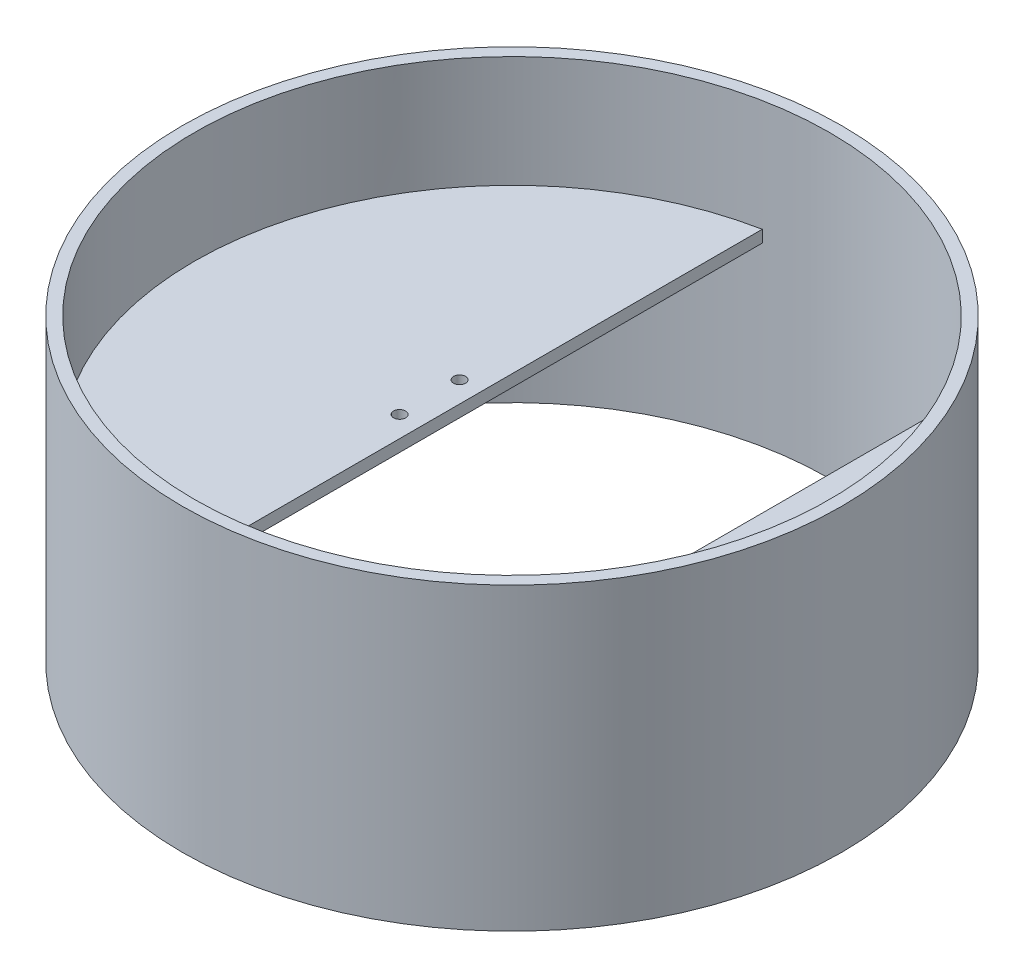
ISO-10303-21;
HEADER;
FILE_DESCRIPTION(('STEP AP214'),'2;1');
FILE_NAME('part.step','',(''),(''),'','','');
FILE_SCHEMA(('AUTOMOTIVE_DESIGN { 1 0 10303 214 1 1 1 1 }'));
ENDSEC;
DATA;
#1=APPLICATION_CONTEXT('core data for automotive mechanical design processes');
#2=APPLICATION_PROTOCOL_DEFINITION('international standard','automotive_design',2000,#1);
#3=PRODUCT_CONTEXT('',#1,'mechanical');
#4=PRODUCT('Part','Part','',(#3));
#5=PRODUCT_RELATED_PRODUCT_CATEGORY('part','',(#4));
#6=PRODUCT_DEFINITION_FORMATION('','',#4);
#7=PRODUCT_DEFINITION_CONTEXT('part definition',#1,'design');
#8=PRODUCT_DEFINITION('design','',#6,#7);
#9=PRODUCT_DEFINITION_SHAPE('','',#8);
#10=(LENGTH_UNIT() NAMED_UNIT(*) SI_UNIT(.MILLI.,.METRE.));
#11=(NAMED_UNIT(*) PLANE_ANGLE_UNIT() SI_UNIT($,.RADIAN.));
#12=(NAMED_UNIT(*) SI_UNIT($,.STERADIAN.) SOLID_ANGLE_UNIT());
#13=UNCERTAINTY_MEASURE_WITH_UNIT(LENGTH_MEASURE(1.E-05),#10,'distance_accuracy_value','');
#14=(GEOMETRIC_REPRESENTATION_CONTEXT(3) GLOBAL_UNCERTAINTY_ASSIGNED_CONTEXT((#13)) GLOBAL_UNIT_ASSIGNED_CONTEXT((#10,
#11,#12)) REPRESENTATION_CONTEXT('',''));
#15=CARTESIAN_POINT('',(0.,0.,0.));
#16=DIRECTION('',(0.,0.,1.));
#17=DIRECTION('',(1.,0.,0.));
#18=AXIS2_PLACEMENT_3D('',#15,#16,#17);
#19=CARTESIAN_POINT('',(0.,50.,0.));
#20=DIRECTION('',(0.,1.,0.));
#21=DIRECTION('',(0.,0.,1.));
#22=AXIS2_PLACEMENT_3D('',#19,#20,#21);
#23=PLANE('',#22);
#24=CARTESIAN_POINT('',(0.,50.,0.));
#25=DIRECTION('',(0.,1.,0.));
#26=DIRECTION('',(0.,0.,1.));
#27=AXIS2_PLACEMENT_3D('',#24,#25,#26);
#28=CIRCLE('',#27,55.);
#29=CARTESIAN_POINT('',(0.,50.,55.));
#30=VERTEX_POINT('',#29);
#31=EDGE_CURVE('E196',#30,#30,#28,.T.);
#32=ORIENTED_EDGE('',*,*,#31,.T.);
#33=EDGE_LOOP('',(#32));
#34=FACE_BOUND('',#33,.T.);
#35=CARTESIAN_POINT('',(0.,50.,0.));
#36=DIRECTION('',(0.,1.,0.));
#37=DIRECTION('',(0.,0.,1.));
#38=AXIS2_PLACEMENT_3D('',#35,#36,#37);
#39=CIRCLE('',#38,53.);
#40=CARTESIAN_POINT('',(0.,50.,53.));
#41=VERTEX_POINT('',#40);
#42=EDGE_CURVE('E195',#41,#41,#39,.T.);
#43=ORIENTED_EDGE('',*,*,#42,.F.);
#44=EDGE_LOOP('',(#43));
#45=FACE_BOUND('',#44,.T.);
#46=ADVANCED_FACE('F43',(#34,#45),#23,.T.);
#47=CARTESIAN_POINT('',(0.,0.,0.));
#48=DIRECTION('',(0.,1.,0.));
#49=DIRECTION('',(0.,0.,1.));
#50=AXIS2_PLACEMENT_3D('',#47,#48,#49);
#51=PLANE('',#50);
#52=CARTESIAN_POINT('',(0.,0.,0.));
#53=DIRECTION('',(0.,1.,0.));
#54=DIRECTION('',(0.,0.,1.));
#55=AXIS2_PLACEMENT_3D('',#52,#53,#54);
#56=CIRCLE('',#55,55.);
#57=CARTESIAN_POINT('',(0.,0.,55.));
#58=VERTEX_POINT('',#57);
#59=EDGE_CURVE('E194',#58,#58,#56,.T.);
#60=ORIENTED_EDGE('',*,*,#59,.F.);
#61=EDGE_LOOP('',(#60));
#62=FACE_BOUND('',#61,.T.);
#63=CARTESIAN_POINT('',(0.,0.,0.));
#64=DIRECTION('',(0.,1.,0.));
#65=DIRECTION('',(0.,0.,1.));
#66=AXIS2_PLACEMENT_3D('',#63,#64,#65);
#67=CIRCLE('',#66,53.);
#68=CARTESIAN_POINT('',(0.,0.,53.));
#69=VERTEX_POINT('',#68);
#70=EDGE_CURVE('E187',#69,#69,#67,.T.);
#71=ORIENTED_EDGE('',*,*,#70,.T.);
#72=EDGE_LOOP('',(#71));
#73=FACE_BOUND('',#72,.T.);
#74=ADVANCED_FACE('F131',(#62,#73),#51,.F.);
#75=CARTESIAN_POINT('',(0.,50.,0.));
#76=DIRECTION('',(0.,-1.,0.));
#77=DIRECTION('',(0.,0.,-1.));
#78=AXIS2_PLACEMENT_3D('',#75,#76,#77);
#79=CYLINDRICAL_SURFACE('',#78,55.);
#80=ORIENTED_EDGE('',*,*,#31,.F.);
#81=EDGE_LOOP('',(#80));
#82=FACE_BOUND('',#81,.T.);
#83=ORIENTED_EDGE('',*,*,#59,.T.);
#84=EDGE_LOOP('',(#83));
#85=FACE_BOUND('',#84,.T.);
#86=ADVANCED_FACE('F44',(#82,#85),#79,.T.);
#87=CARTESIAN_POINT('',(0.,50.,0.));
#88=DIRECTION('',(0.,-1.,0.));
#89=DIRECTION('',(0.,0.,-1.));
#90=AXIS2_PLACEMENT_3D('',#87,#88,#89);
#91=CYLINDRICAL_SURFACE('',#90,53.);
#92=CARTESIAN_POINT('',(0.,31.4,0.));
#93=DIRECTION('',(0.,1.,0.));
#94=DIRECTION('',(0.,0.,1.));
#95=AXIS2_PLACEMENT_3D('',#92,#93,#94);
#96=CIRCLE('',#95,53.);
#97=CARTESIAN_POINT('',(-10.25,31.4,-51.9993990349888));
#98=VERTEX_POINT('',#97);
#99=CARTESIAN_POINT('',(-10.25,31.4,51.9993990349888));
#100=VERTEX_POINT('',#99);
#101=EDGE_CURVE('E11',#98,#100,#96,.T.);
#102=ORIENTED_EDGE('',*,*,#101,.F.);
#103=DIRECTION('',(0.,-1.,0.));
#104=VECTOR('',#103,1.);
#105=CARTESIAN_POINT('',(-10.25,50.,-51.9993990349888));
#106=LINE('',#105,#104);
#107=CARTESIAN_POINT('',(-10.25,29.4,-51.9993990349888));
#108=VERTEX_POINT('',#107);
#109=EDGE_CURVE('E55',#108,#98,#106,.F.);
#110=ORIENTED_EDGE('',*,*,#109,.F.);
#111=CARTESIAN_POINT('',(0.,29.4,0.));
#112=DIRECTION('',(0.,1.,0.));
#113=DIRECTION('',(0.,0.,1.));
#114=AXIS2_PLACEMENT_3D('',#111,#112,#113);
#115=CIRCLE('',#114,53.);
#116=CARTESIAN_POINT('',(-10.25,29.4,51.9993990349888));
#117=VERTEX_POINT('',#116);
#118=EDGE_CURVE('E82',#108,#117,#115,.T.);
#119=ORIENTED_EDGE('',*,*,#118,.T.);
#120=DIRECTION('',(0.,-1.,0.));
#121=VECTOR('',#120,1.);
#122=CARTESIAN_POINT('',(-10.25,50.,51.9993990349888));
#123=LINE('',#122,#121);
#124=EDGE_CURVE('E86',#100,#117,#123,.T.);
#125=ORIENTED_EDGE('',*,*,#124,.F.);
#126=EDGE_LOOP('',(#102,#110,#119,#125));
#127=FACE_BOUND('',#126,.T.);
#128=CARTESIAN_POINT('',(0.,31.4,0.));
#129=DIRECTION('',(0.,1.,0.));
#130=DIRECTION('',(0.,0.,1.));
#131=AXIS2_PLACEMENT_3D('',#128,#129,#130);
#132=CIRCLE('',#131,53.);
#133=CARTESIAN_POINT('',(30.75,31.4,43.1675514709834));
#134=VERTEX_POINT('',#133);
#135=CARTESIAN_POINT('',(30.75,31.4,-43.1675514709834));
#136=VERTEX_POINT('',#135);
#137=EDGE_CURVE('E90',#134,#136,#132,.T.);
#138=ORIENTED_EDGE('',*,*,#137,.F.);
#139=DIRECTION('',(0.,-1.,0.));
#140=VECTOR('',#139,1.);
#141=CARTESIAN_POINT('',(30.75,50.,43.1675514709834));
#142=LINE('',#141,#140);
#143=CARTESIAN_POINT('',(30.75,29.4,43.1675514709834));
#144=VERTEX_POINT('',#143);
#145=EDGE_CURVE('E202',#144,#134,#142,.F.);
#146=ORIENTED_EDGE('',*,*,#145,.F.);
#147=CARTESIAN_POINT('',(0.,29.4,0.));
#148=DIRECTION('',(0.,1.,0.));
#149=DIRECTION('',(0.,0.,1.));
#150=AXIS2_PLACEMENT_3D('',#147,#148,#149);
#151=CIRCLE('',#150,53.);
#152=CARTESIAN_POINT('',(30.75,29.4,-43.1675514709834));
#153=VERTEX_POINT('',#152);
#154=EDGE_CURVE('E199',#144,#153,#151,.T.);
#155=ORIENTED_EDGE('',*,*,#154,.T.);
#156=DIRECTION('',(0.,-1.,0.));
#157=VECTOR('',#156,1.);
#158=CARTESIAN_POINT('',(30.75,50.,-43.1675514709834));
#159=LINE('',#158,#157);
#160=EDGE_CURVE('E210',#136,#153,#159,.T.);
#161=ORIENTED_EDGE('',*,*,#160,.F.);
#162=EDGE_LOOP('',(#138,#146,#155,#161));
#163=FACE_BOUND('',#162,.T.);
#164=ORIENTED_EDGE('',*,*,#42,.T.);
#165=EDGE_LOOP('',(#164));
#166=FACE_BOUND('',#165,.T.);
#167=ORIENTED_EDGE('',*,*,#70,.F.);
#168=EDGE_LOOP('',(#167));
#169=FACE_BOUND('',#168,.T.);
#170=ADVANCED_FACE('F98',(#127,#163,#166,#169),#91,.F.);
#171=CARTESIAN_POINT('',(30.75,31.4,-43.1675514709834));
#172=DIRECTION('',(-1.,0.,0.));
#173=DIRECTION('',(0.,0.,1.));
#174=AXIS2_PLACEMENT_3D('',#171,#172,#173);
#175=PLANE('',#174);
#176=DIRECTION('',(0.,0.,1.));
#177=VECTOR('',#176,1.);
#178=CARTESIAN_POINT('',(30.75,31.4,-43.1675514709834));
#179=LINE('',#178,#177);
#180=EDGE_CURVE('E186',#136,#134,#179,.T.);
#181=ORIENTED_EDGE('',*,*,#180,.F.);
#182=ORIENTED_EDGE('',*,*,#160,.T.);
#183=DIRECTION('',(0.,0.,1.));
#184=VECTOR('',#183,1.);
#185=CARTESIAN_POINT('',(30.75,29.4,0.));
#186=LINE('',#185,#184);
#187=EDGE_CURVE('E66',#153,#144,#186,.T.);
#188=ORIENTED_EDGE('',*,*,#187,.T.);
#189=ORIENTED_EDGE('',*,*,#145,.T.);
#190=EDGE_LOOP('',(#181,#182,#188,#189));
#191=FACE_BOUND('',#190,.T.);
#192=ADVANCED_FACE('F145',(#191),#175,.T.);
#193=CARTESIAN_POINT('',(0.,31.4,0.));
#194=DIRECTION('',(0.,1.,0.));
#195=DIRECTION('',(0.,0.,1.));
#196=AXIS2_PLACEMENT_3D('',#193,#194,#195);
#197=PLANE('',#196);
#198=CARTESIAN_POINT('',(34.25,31.4,-4.99999999999999));
#199=DIRECTION('',(0.,1.,0.));
#200=DIRECTION('',(0.,0.,-1.));
#201=AXIS2_PLACEMENT_3D('',#198,#199,#200);
#202=CIRCLE('',#201,0.999999999999998);
#203=CARTESIAN_POINT('',(34.25,31.4,-5.99999999999999));
#204=VERTEX_POINT('',#203);
#205=EDGE_CURVE('E177',#204,#204,#202,.T.);
#206=ORIENTED_EDGE('',*,*,#205,.F.);
#207=EDGE_LOOP('',(#206));
#208=FACE_BOUND('',#207,.T.);
#209=CARTESIAN_POINT('',(34.25,31.4,4.99999999999999));
#210=DIRECTION('',(0.,1.,0.));
#211=DIRECTION('',(0.,0.,1.));
#212=AXIS2_PLACEMENT_3D('',#209,#210,#211);
#213=CIRCLE('',#212,0.999999999999998);
#214=CARTESIAN_POINT('',(34.25,31.4,5.99999999999999));
#215=VERTEX_POINT('',#214);
#216=EDGE_CURVE('E179',#215,#215,#213,.T.);
#217=ORIENTED_EDGE('',*,*,#216,.F.);
#218=EDGE_LOOP('',(#217));
#219=FACE_BOUND('',#218,.T.);
#220=ORIENTED_EDGE('',*,*,#180,.T.);
#221=ORIENTED_EDGE('',*,*,#137,.T.);
#222=EDGE_LOOP('',(#220,#221));
#223=FACE_BOUND('',#222,.T.);
#224=ADVANCED_FACE('F150',(#208,#219,#223),#197,.T.);
#225=CARTESIAN_POINT('',(0.,29.4,0.));
#226=DIRECTION('',(0.,1.,0.));
#227=DIRECTION('',(0.,0.,1.));
#228=AXIS2_PLACEMENT_3D('',#225,#226,#227);
#229=PLANE('',#228);
#230=CARTESIAN_POINT('',(34.25,29.4,-4.99999999999999));
#231=DIRECTION('',(0.,1.,0.));
#232=DIRECTION('',(0.,0.,1.));
#233=AXIS2_PLACEMENT_3D('',#230,#231,#232);
#234=CIRCLE('',#233,0.999999999999998);
#235=CARTESIAN_POINT('',(34.25,29.4,-4.));
#236=VERTEX_POINT('',#235);
#237=EDGE_CURVE('E50',#236,#236,#234,.T.);
#238=ORIENTED_EDGE('',*,*,#237,.T.);
#239=EDGE_LOOP('',(#238));
#240=FACE_BOUND('',#239,.T.);
#241=CARTESIAN_POINT('',(34.25,29.4,4.99999999999999));
#242=DIRECTION('',(0.,1.,0.));
#243=DIRECTION('',(0.,0.,1.));
#244=AXIS2_PLACEMENT_3D('',#241,#242,#243);
#245=CIRCLE('',#244,0.999999999999998);
#246=CARTESIAN_POINT('',(34.25,29.4,5.99999999999999));
#247=VERTEX_POINT('',#246);
#248=EDGE_CURVE('E108',#247,#247,#245,.T.);
#249=ORIENTED_EDGE('',*,*,#248,.T.);
#250=EDGE_LOOP('',(#249));
#251=FACE_BOUND('',#250,.T.);
#252=ORIENTED_EDGE('',*,*,#154,.F.);
#253=ORIENTED_EDGE('',*,*,#187,.F.);
#254=EDGE_LOOP('',(#252,#253));
#255=FACE_BOUND('',#254,.T.);
#256=ADVANCED_FACE('F119',(#240,#251,#255),#229,.F.);
#257=CARTESIAN_POINT('',(-10.25,31.4,-51.9993990349888));
#258=DIRECTION('',(-1.,0.,0.));
#259=DIRECTION('',(0.,0.,1.));
#260=AXIS2_PLACEMENT_3D('',#257,#258,#259);
#261=PLANE('',#260);
#262=DIRECTION('',(0.,0.,1.));
#263=VECTOR('',#262,1.);
#264=CARTESIAN_POINT('',(-10.25,29.4,0.));
#265=LINE('',#264,#263);
#266=EDGE_CURVE('E56',#108,#117,#265,.T.);
#267=ORIENTED_EDGE('',*,*,#266,.F.);
#268=ORIENTED_EDGE('',*,*,#109,.T.);
#269=DIRECTION('',(0.,0.,1.));
#270=VECTOR('',#269,1.);
#271=CARTESIAN_POINT('',(-10.25,31.4,-51.9993990349888));
#272=LINE('',#271,#270);
#273=EDGE_CURVE('E92',#98,#100,#272,.T.);
#274=ORIENTED_EDGE('',*,*,#273,.T.);
#275=ORIENTED_EDGE('',*,*,#124,.T.);
#276=EDGE_LOOP('',(#267,#268,#274,#275));
#277=FACE_BOUND('',#276,.T.);
#278=ADVANCED_FACE('F95',(#277),#261,.F.);
#279=CARTESIAN_POINT('',(0.,31.4,0.));
#280=DIRECTION('',(0.,1.,0.));
#281=DIRECTION('',(0.,0.,1.));
#282=AXIS2_PLACEMENT_3D('',#279,#280,#281);
#283=PLANE('',#282);
#284=CARTESIAN_POINT('',(-13.75,31.4,-5.));
#285=DIRECTION('',(0.,1.,0.));
#286=DIRECTION('',(0.,0.,-1.));
#287=AXIS2_PLACEMENT_3D('',#284,#285,#286);
#288=CIRCLE('',#287,1.);
#289=CARTESIAN_POINT('',(-13.75,31.4,-6.));
#290=VERTEX_POINT('',#289);
#291=EDGE_CURVE('E175',#290,#290,#288,.T.);
#292=ORIENTED_EDGE('',*,*,#291,.F.);
#293=EDGE_LOOP('',(#292));
#294=FACE_BOUND('',#293,.T.);
#295=CARTESIAN_POINT('',(-13.75,31.4,5.));
#296=DIRECTION('',(0.,1.,0.));
#297=DIRECTION('',(0.,0.,1.));
#298=AXIS2_PLACEMENT_3D('',#295,#296,#297);
#299=CIRCLE('',#298,1.);
#300=CARTESIAN_POINT('',(-13.75,31.4,6.));
#301=VERTEX_POINT('',#300);
#302=EDGE_CURVE('E110',#301,#301,#299,.T.);
#303=ORIENTED_EDGE('',*,*,#302,.F.);
#304=EDGE_LOOP('',(#303));
#305=FACE_BOUND('',#304,.T.);
#306=ORIENTED_EDGE('',*,*,#273,.F.);
#307=ORIENTED_EDGE('',*,*,#101,.T.);
#308=EDGE_LOOP('',(#306,#307));
#309=FACE_BOUND('',#308,.T.);
#310=ADVANCED_FACE('F156',(#294,#305,#309),#283,.T.);
#311=CARTESIAN_POINT('',(0.,29.4,0.));
#312=DIRECTION('',(0.,1.,0.));
#313=DIRECTION('',(0.,0.,1.));
#314=AXIS2_PLACEMENT_3D('',#311,#312,#313);
#315=PLANE('',#314);
#316=CARTESIAN_POINT('',(-13.75,29.4,-5.));
#317=DIRECTION('',(0.,1.,0.));
#318=DIRECTION('',(0.,0.,1.));
#319=AXIS2_PLACEMENT_3D('',#316,#317,#318);
#320=CIRCLE('',#319,1.);
#321=CARTESIAN_POINT('',(-13.75,29.4,-4.));
#322=VERTEX_POINT('',#321);
#323=EDGE_CURVE('E106',#322,#322,#320,.T.);
#324=ORIENTED_EDGE('',*,*,#323,.T.);
#325=EDGE_LOOP('',(#324));
#326=FACE_BOUND('',#325,.T.);
#327=CARTESIAN_POINT('',(-13.75,29.4,5.));
#328=DIRECTION('',(0.,1.,0.));
#329=DIRECTION('',(0.,0.,1.));
#330=AXIS2_PLACEMENT_3D('',#327,#328,#329);
#331=CIRCLE('',#330,1.);
#332=CARTESIAN_POINT('',(-13.75,29.4,6.));
#333=VERTEX_POINT('',#332);
#334=EDGE_CURVE('E103',#333,#333,#331,.T.);
#335=ORIENTED_EDGE('',*,*,#334,.T.);
#336=EDGE_LOOP('',(#335));
#337=FACE_BOUND('',#336,.T.);
#338=ORIENTED_EDGE('',*,*,#118,.F.);
#339=ORIENTED_EDGE('',*,*,#266,.T.);
#340=EDGE_LOOP('',(#338,#339));
#341=FACE_BOUND('',#340,.T.);
#342=ADVANCED_FACE('F83',(#326,#337,#341),#315,.F.);
#343=CARTESIAN_POINT('',(-13.75,0.,5.));
#344=DIRECTION('',(0.,1.,0.));
#345=DIRECTION('',(0.,0.,1.));
#346=AXIS2_PLACEMENT_3D('',#343,#344,#345);
#347=CYLINDRICAL_SURFACE('',#346,1.);
#348=ORIENTED_EDGE('',*,*,#302,.T.);
#349=EDGE_LOOP('',(#348));
#350=FACE_BOUND('',#349,.T.);
#351=ORIENTED_EDGE('',*,*,#334,.F.);
#352=EDGE_LOOP('',(#351));
#353=FACE_BOUND('',#352,.T.);
#354=ADVANCED_FACE('F157',(#350,#353),#347,.F.);
#355=CARTESIAN_POINT('',(-13.75,0.,-5.));
#356=DIRECTION('',(0.,1.,0.));
#357=DIRECTION('',(0.,0.,1.));
#358=AXIS2_PLACEMENT_3D('',#355,#356,#357);
#359=CYLINDRICAL_SURFACE('',#358,1.);
#360=ORIENTED_EDGE('',*,*,#291,.T.);
#361=EDGE_LOOP('',(#360));
#362=FACE_BOUND('',#361,.T.);
#363=ORIENTED_EDGE('',*,*,#323,.F.);
#364=EDGE_LOOP('',(#363));
#365=FACE_BOUND('',#364,.T.);
#366=ADVANCED_FACE('F127',(#362,#365),#359,.F.);
#367=CARTESIAN_POINT('',(34.25,0.,4.99999999999999));
#368=DIRECTION('',(0.,1.,0.));
#369=DIRECTION('',(0.,0.,1.));
#370=AXIS2_PLACEMENT_3D('',#367,#368,#369);
#371=CYLINDRICAL_SURFACE('',#370,0.999999999999998);
#372=ORIENTED_EDGE('',*,*,#216,.T.);
#373=EDGE_LOOP('',(#372));
#374=FACE_BOUND('',#373,.T.);
#375=ORIENTED_EDGE('',*,*,#248,.F.);
#376=EDGE_LOOP('',(#375));
#377=FACE_BOUND('',#376,.T.);
#378=ADVANCED_FACE('F117',(#374,#377),#371,.F.);
#379=CARTESIAN_POINT('',(34.25,0.,-4.99999999999999));
#380=DIRECTION('',(0.,1.,0.));
#381=DIRECTION('',(0.,0.,1.));
#382=AXIS2_PLACEMENT_3D('',#379,#380,#381);
#383=CYLINDRICAL_SURFACE('',#382,0.999999999999998);
#384=ORIENTED_EDGE('',*,*,#205,.T.);
#385=EDGE_LOOP('',(#384));
#386=FACE_BOUND('',#385,.T.);
#387=ORIENTED_EDGE('',*,*,#237,.F.);
#388=EDGE_LOOP('',(#387));
#389=FACE_BOUND('',#388,.T.);
#390=ADVANCED_FACE('F120',(#386,#389),#383,.F.);
#391=CLOSED_SHELL('',(#46,#74,#86,#170,#192,#224,#256,#278,#310,#342,#354,#366,#378,#390));
#392=MANIFOLD_SOLID_BREP('B2',#391);
#393=ADVANCED_BREP_SHAPE_REPRESENTATION('',(#18,#392),#14);
#394=SHAPE_DEFINITION_REPRESENTATION(#9,#393);
ENDSEC;
END-ISO-10303-21;
